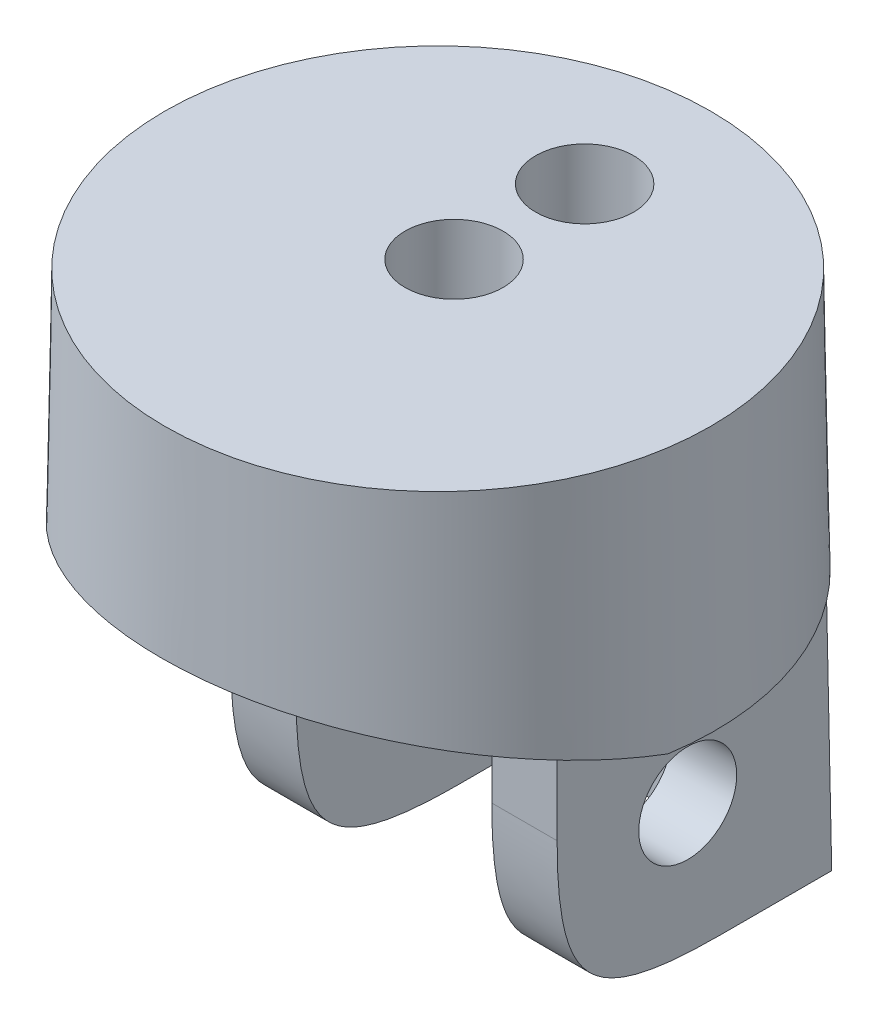
ISO-10303-21;
HEADER;
FILE_DESCRIPTION(('STEP AP214'),'2;1');
FILE_NAME('part.step','',(''),(''),'','','');
FILE_SCHEMA(('AUTOMOTIVE_DESIGN { 1 0 10303 214 1 1 1 1 }'));
ENDSEC;
DATA;
#1=APPLICATION_CONTEXT('core data for automotive mechanical design processes');
#2=APPLICATION_PROTOCOL_DEFINITION('international standard','automotive_design',2000,#1);
#3=PRODUCT_CONTEXT('',#1,'mechanical');
#4=PRODUCT('Part','Part','',(#3));
#5=PRODUCT_RELATED_PRODUCT_CATEGORY('part','',(#4));
#6=PRODUCT_DEFINITION_FORMATION('','',#4);
#7=PRODUCT_DEFINITION_CONTEXT('part definition',#1,'design');
#8=PRODUCT_DEFINITION('design','',#6,#7);
#9=PRODUCT_DEFINITION_SHAPE('','',#8);
#10=(LENGTH_UNIT() NAMED_UNIT(*) SI_UNIT(.MILLI.,.METRE.));
#11=(NAMED_UNIT(*) PLANE_ANGLE_UNIT() SI_UNIT($,.RADIAN.));
#12=(NAMED_UNIT(*) SI_UNIT($,.STERADIAN.) SOLID_ANGLE_UNIT());
#13=UNCERTAINTY_MEASURE_WITH_UNIT(LENGTH_MEASURE(1.E-05),#10,'distance_accuracy_value','');
#14=(GEOMETRIC_REPRESENTATION_CONTEXT(3) GLOBAL_UNCERTAINTY_ASSIGNED_CONTEXT((#13)) GLOBAL_UNIT_ASSIGNED_CONTEXT((#10,
#11,#12)) REPRESENTATION_CONTEXT('',''));
#15=CARTESIAN_POINT('',(0.,0.,0.));
#16=DIRECTION('',(0.,0.,1.));
#17=DIRECTION('',(1.,0.,0.));
#18=AXIS2_PLACEMENT_3D('',#15,#16,#17);
#19=CARTESIAN_POINT('',(0.,8.,0.));
#20=DIRECTION('',(0.,1.,0.));
#21=DIRECTION('',(0.,0.,1.));
#22=AXIS2_PLACEMENT_3D('',#19,#20,#21);
#23=PLANE('',#22);
#24=CARTESIAN_POINT('',(0.,8.,-0.5));
#25=DIRECTION('',(0.,1.,0.));
#26=DIRECTION('',(0.,0.,1.));
#27=AXIS2_PLACEMENT_3D('',#24,#25,#26);
#28=CIRCLE('',#27,1.5);
#29=CARTESIAN_POINT('',(0.,8.,1.));
#30=VERTEX_POINT('',#29);
#31=EDGE_CURVE('E274',#30,#30,#28,.F.);
#32=ORIENTED_EDGE('',*,*,#31,.T.);
#33=EDGE_LOOP('',(#32));
#34=FACE_BOUND('',#33,.T.);
#35=CARTESIAN_POINT('',(0.,8.,-4.5));
#36=DIRECTION('',(0.,1.,0.));
#37=DIRECTION('',(0.,0.,1.));
#38=AXIS2_PLACEMENT_3D('',#35,#36,#37);
#39=CIRCLE('',#38,1.5);
#40=CARTESIAN_POINT('',(0.,8.,-3.));
#41=VERTEX_POINT('',#40);
#42=EDGE_CURVE('E42',#41,#41,#39,.F.);
#43=ORIENTED_EDGE('',*,*,#42,.T.);
#44=EDGE_LOOP('',(#43));
#45=FACE_BOUND('',#44,.T.);
#46=CARTESIAN_POINT('',(0.,8.,0.));
#47=DIRECTION('',(0.,1.,0.));
#48=DIRECTION('',(0.,0.,1.));
#49=AXIS2_PLACEMENT_3D('',#46,#47,#48);
#50=CIRCLE('',#49,8.36035948057426);
#51=CARTESIAN_POINT('',(0.,8.,8.36035948057426));
#52=VERTEX_POINT('',#51);
#53=EDGE_CURVE('E275',#52,#52,#50,.F.);
#54=ORIENTED_EDGE('',*,*,#53,.F.);
#55=EDGE_LOOP('',(#54));
#56=FACE_BOUND('',#55,.T.);
#57=ADVANCED_FACE('F34',(#34,#45,#56),#23,.T.);
#58=CARTESIAN_POINT('',(0.,0.,0.));
#59=DIRECTION('',(0.,-1.,0.));
#60=DIRECTION('',(0.,0.,1.));
#61=AXIS2_PLACEMENT_3D('',#58,#59,#60);
#62=CONICAL_SURFACE('',#61,8.5,0.0174532925199433);
#63=CARTESIAN_POINT('',(0.,0.,0.));
#64=DIRECTION('',(0.,1.,0.));
#65=DIRECTION('',(0.,0.,1.));
#66=AXIS2_PLACEMENT_3D('',#63,#64,#65);
#67=CIRCLE('',#66,8.5);
#68=CARTESIAN_POINT('',(-8.39324774628024,0.,1.34290441564604));
#69=VERTEX_POINT('',#68);
#70=CARTESIAN_POINT('',(-5.,0.,-6.87386354243376));
#71=VERTEX_POINT('',#70);
#72=EDGE_CURVE('E200',#69,#71,#67,.F.);
#73=ORIENTED_EDGE('',*,*,#72,.F.);
#74=CARTESIAN_POINT('',(0.,-0.370490605018436,-0.0397853460097106));
#75=DIRECTION('',(0.,0.965925826289069,-0.258819045102518));
#76=DIRECTION('',(0.,-0.258819045102518,-0.965925826289069));
#77=AXIS2_PLACEMENT_3D('',#74,#75,#76);
#78=ELLIPSE('',#77,8.80654259990787,8.50637389762198);
#79=CARTESIAN_POINT('',(8.39324774628024,0.,1.34290441564604));
#80=VERTEX_POINT('',#79);
#81=EDGE_CURVE('E189',#80,#69,#78,.F.);
#82=ORIENTED_EDGE('',*,*,#81,.F.);
#83=CARTESIAN_POINT('',(0.,0.,0.));
#84=DIRECTION('',(0.,1.,0.));
#85=DIRECTION('',(0.,0.,1.));
#86=AXIS2_PLACEMENT_3D('',#83,#84,#85);
#87=CIRCLE('',#86,8.5);
#88=CARTESIAN_POINT('',(5.,0.,-6.87386354243376));
#89=VERTEX_POINT('',#88);
#90=EDGE_CURVE('E209',#89,#80,#87,.F.);
#91=ORIENTED_EDGE('',*,*,#90,.F.);
#92=CARTESIAN_POINT('',(5.,-24.8576985156656,-7.40367743203639));
#93=CARTESIAN_POINT('',(5.,-22.028515475189,-7.34408647566452));
#94=CARTESIAN_POINT('',(5.,-19.1993371463825,-7.28427152481865));
#95=CARTESIAN_POINT('',(5.,-13.5409908876973,-7.16415639491989));
#96=CARTESIAN_POINT('',(5.,-10.7118229578183,-7.1038562158837));
#97=CARTESIAN_POINT('',(5.,-5.0534982639313,-6.98273338595101));
#98=CARTESIAN_POINT('',(5.,-2.22434149992342,-6.92191073505196));
#99=CARTESIAN_POINT('',(5.,3.43395988768084,-6.79969889757456));
#100=CARTESIAN_POINT('',(5.,6.26310451127679,-6.73830971097671));
#101=CARTESIAN_POINT('',(5.,9.09224248686586,-6.67661522656715));
#102=B_SPLINE_CURVE_WITH_KNOTS('',3,(#92,#93,#94,#95,#96,#97,#98,#99,#100,#101),.UNSPECIFIED.,
.F.,.F.,(4,2,2,2,4),(0.,8.4894316553225,16.9788630183329,25.4682944227907,33.9577261196273),.UNSPECIFIED.);
#103=CARTESIAN_POINT('',(5.,-9.,-7.06719915925969));
#104=VERTEX_POINT('',#103);
#105=EDGE_CURVE('E343',#104,#89,#102,.T.);
#106=ORIENTED_EDGE('',*,*,#105,.F.);
#107=CARTESIAN_POINT('',(0.,-9.,0.));
#108=DIRECTION('',(0.,1.,0.));
#109=DIRECTION('',(0.,0.,1.));
#110=AXIS2_PLACEMENT_3D('',#107,#108,#109);
#111=CIRCLE('',#110,8.65709558435396);
#112=CARTESIAN_POINT('',(-5.,-9.,-7.06719915925969));
#113=VERTEX_POINT('',#112);
#114=EDGE_CURVE('E192',#104,#113,#111,.T.);
#115=ORIENTED_EDGE('',*,*,#114,.T.);
#116=CARTESIAN_POINT('',(-5.,-24.8576985156656,-7.40367743203639));
#117=CARTESIAN_POINT('',(-5.,-22.028515475189,-7.34408647566453));
#118=CARTESIAN_POINT('',(-5.,-19.1993371463825,-7.28427152481866));
#119=CARTESIAN_POINT('',(-5.,-13.5409908876973,-7.16415639491989));
#120=CARTESIAN_POINT('',(-5.,-10.7118229578183,-7.1038562158837));
#121=CARTESIAN_POINT('',(-5.,-5.05349826393131,-6.98273338595101));
#122=CARTESIAN_POINT('',(-5.,-2.22434149992342,-6.92191073505196));
#123=CARTESIAN_POINT('',(-5.,3.43395988768084,-6.79969889757456));
#124=CARTESIAN_POINT('',(-5.,6.26310451127679,-6.7383097109767));
#125=CARTESIAN_POINT('',(-5.,9.09224248686585,-6.67661522656714));
#126=B_SPLINE_CURVE_WITH_KNOTS('',3,(#116,#117,#118,#119,#120,#121,#122,#123,#124,#125),
.UNSPECIFIED.,.F.,.F.,(4,2,2,2,4),(0.,8.4894316553225,16.9788630183329,25.4682944227907,
33.9577261196273),.UNSPECIFIED.);
#127=EDGE_CURVE('E202',#113,#71,#126,.T.);
#128=ORIENTED_EDGE('',*,*,#127,.T.);
#129=EDGE_LOOP('',(#73,#82,#91,#106,#115,#128));
#130=FACE_BOUND('',#129,.T.);
#131=ORIENTED_EDGE('',*,*,#53,.T.);
#132=EDGE_LOOP('',(#131));
#133=FACE_BOUND('',#132,.T.);
#134=ADVANCED_FACE('F211',(#130,#133),#62,.T.);
#135=CARTESIAN_POINT('',(0.,-9.23352252799543,-0.5));
#136=DIRECTION('',(0.,1.,0.));
#137=DIRECTION('',(0.,0.,1.));
#138=AXIS2_PLACEMENT_3D('',#135,#136,#137);
#139=CYLINDRICAL_SURFACE('',#138,1.5);
#140=CARTESIAN_POINT('',(0.,0.,-0.5));
#141=DIRECTION('',(0.,1.,0.));
#142=DIRECTION('',(0.,0.,1.));
#143=AXIS2_PLACEMENT_3D('',#140,#141,#142);
#144=CIRCLE('',#143,1.5);
#145=CARTESIAN_POINT('',(0.,0.,1.));
#146=VERTEX_POINT('',#145);
#147=EDGE_CURVE('E11',#146,#146,#144,.F.);
#148=ORIENTED_EDGE('',*,*,#147,.T.);
#149=EDGE_LOOP('',(#148));
#150=FACE_BOUND('',#149,.T.);
#151=ORIENTED_EDGE('',*,*,#31,.F.);
#152=EDGE_LOOP('',(#151));
#153=FACE_BOUND('',#152,.T.);
#154=ADVANCED_FACE('F261',(#150,#153),#139,.F.);
#155=CARTESIAN_POINT('',(0.,-9.23352252799543,-4.5));
#156=DIRECTION('',(0.,1.,0.));
#157=DIRECTION('',(0.,0.,1.));
#158=AXIS2_PLACEMENT_3D('',#155,#156,#157);
#159=CYLINDRICAL_SURFACE('',#158,1.5);
#160=CARTESIAN_POINT('',(0.,0.,-4.5));
#161=DIRECTION('',(0.,1.,0.));
#162=DIRECTION('',(0.,0.,1.));
#163=AXIS2_PLACEMENT_3D('',#160,#161,#162);
#164=CIRCLE('',#163,1.5);
#165=CARTESIAN_POINT('',(0.,0.,-3.));
#166=VERTEX_POINT('',#165);
#167=EDGE_CURVE('E47',#166,#166,#164,.F.);
#168=ORIENTED_EDGE('',*,*,#167,.T.);
#169=EDGE_LOOP('',(#168));
#170=FACE_BOUND('',#169,.T.);
#171=ORIENTED_EDGE('',*,*,#42,.F.);
#172=EDGE_LOOP('',(#171));
#173=FACE_BOUND('',#172,.T.);
#174=ADVANCED_FACE('F258',(#170,#173),#159,.F.);
#175=CARTESIAN_POINT('',(-8.65709558435396,-9.,1.34290441564604));
#176=DIRECTION('',(0.,0.,-1.));
#177=DIRECTION('',(-1.,0.,0.));
#178=AXIS2_PLACEMENT_3D('',#175,#176,#177);
#179=PLANE('',#178);
#180=DIRECTION('',(1.,0.,0.));
#181=VECTOR('',#180,1.);
#182=CARTESIAN_POINT('',(-8.65709558435396,0.,1.34290441564604));
#183=LINE('',#182,#181);
#184=CARTESIAN_POINT('',(3.,0.,1.34290441564604));
#185=VERTEX_POINT('',#184);
#186=CARTESIAN_POINT('',(5.,0.,1.34290441564604));
#187=VERTEX_POINT('',#186);
#188=EDGE_CURVE('E199',#185,#187,#183,.T.);
#189=ORIENTED_EDGE('',*,*,#188,.F.);
#190=DIRECTION('',(0.,-1.,0.));
#191=VECTOR('',#190,1.);
#192=CARTESIAN_POINT('',(3.,-9.,1.34290441564604));
#193=LINE('',#192,#191);
#194=CARTESIAN_POINT('',(3.,-4.,1.34290441564604));
#195=VERTEX_POINT('',#194);
#196=EDGE_CURVE('E297',#185,#195,#193,.T.);
#197=ORIENTED_EDGE('',*,*,#196,.T.);
#198=CARTESIAN_POINT('',(5.5,-4.,1.34290441564604));
#199=CARTESIAN_POINT('',(1.83333333333333,-4.,1.34290441564604));
#200=CARTESIAN_POINT('',(-1.83333333333334,-4.,1.34290441564604));
#201=CARTESIAN_POINT('',(-5.5,-4.,1.34290441564604));
#202=(BOUNDED_CURVE() B_SPLINE_CURVE(3,(#198,#199,#200,#201),.UNSPECIFIED.,.F.,
.F.) B_SPLINE_CURVE_WITH_KNOTS((4,4),(-0.0055,0.0055),
.UNSPECIFIED.) CURVE() GEOMETRIC_REPRESENTATION_ITEM() RATIONAL_B_SPLINE_CURVE((1.,1.,1.,1.)) REPRESENTATION_ITEM(''));
#203=CARTESIAN_POINT('',(5.,-4.,1.34290441564604));
#204=VERTEX_POINT('',#203);
#205=EDGE_CURVE('E152',#195,#204,#202,.F.);
#206=ORIENTED_EDGE('',*,*,#205,.T.);
#207=DIRECTION('',(0.,-1.,0.));
#208=VECTOR('',#207,1.);
#209=CARTESIAN_POINT('',(5.,0.,1.34290441564604));
#210=LINE('',#209,#208);
#211=EDGE_CURVE('E159',#187,#204,#210,.T.);
#212=ORIENTED_EDGE('',*,*,#211,.F.);
#213=EDGE_LOOP('',(#189,#197,#206,#212));
#214=FACE_BOUND('',#213,.T.);
#215=ADVANCED_FACE('F260',(#214),#179,.F.);
#216=CARTESIAN_POINT('',(-8.5,-5.,-2.65709558435396));
#217=DIRECTION('',(1.,0.,0.));
#218=DIRECTION('',(0.,1.,0.));
#219=AXIS2_PLACEMENT_3D('',#216,#217,#218);
#220=CYLINDRICAL_SURFACE('',#219,1.5);
#221=CARTESIAN_POINT('',(3.,-5.,-2.65709558435396));
#222=DIRECTION('',(1.,0.,0.));
#223=DIRECTION('',(0.,0.,-1.));
#224=AXIS2_PLACEMENT_3D('',#221,#222,#223);
#225=CIRCLE('',#224,1.5);
#226=CARTESIAN_POINT('',(3.,-5.,-4.15709558435396));
#227=VERTEX_POINT('',#226);
#228=EDGE_CURVE('E188',#227,#227,#225,.F.);
#229=ORIENTED_EDGE('',*,*,#228,.T.);
#230=EDGE_LOOP('',(#229));
#231=FACE_BOUND('',#230,.T.);
#232=CARTESIAN_POINT('',(5.,-5.,-2.65709558435396));
#233=DIRECTION('',(-1.,0.,0.));
#234=DIRECTION('',(0.,-1.,0.));
#235=AXIS2_PLACEMENT_3D('',#232,#233,#234);
#236=CIRCLE('',#235,1.5);
#237=CARTESIAN_POINT('',(5.,-6.5,-2.65709558435396));
#238=VERTEX_POINT('',#237);
#239=EDGE_CURVE('E163',#238,#238,#236,.T.);
#240=ORIENTED_EDGE('',*,*,#239,.F.);
#241=EDGE_LOOP('',(#240));
#242=FACE_BOUND('',#241,.T.);
#243=ADVANCED_FACE('F227',(#231,#242),#220,.F.);
#244=CARTESIAN_POINT('',(5.5,-9.,-3.65709558435396));
#245=CARTESIAN_POINT('',(1.83333333333333,-9.,-3.65709558435396));
#246=CARTESIAN_POINT('',(-1.83333333333334,-9.,-3.65709558435396));
#247=CARTESIAN_POINT('',(-5.5,-9.,-3.65709558435396));
#248=CARTESIAN_POINT('',(5.5,-9.,1.34290441564604));
#249=CARTESIAN_POINT('',(1.83333333333333,-9.,1.34290441564604));
#250=CARTESIAN_POINT('',(-1.83333333333334,-9.,1.34290441564604));
#251=CARTESIAN_POINT('',(-5.5,-9.,1.34290441564604));
#252=CARTESIAN_POINT('',(5.5,-4.,1.34290441564604));
#253=CARTESIAN_POINT('',(1.83333333333333,-4.,1.34290441564604));
#254=CARTESIAN_POINT('',(-1.83333333333334,-4.,1.34290441564604));
#255=CARTESIAN_POINT('',(-5.5,-4.,1.34290441564604));
#256=(BOUNDED_SURFACE() B_SPLINE_SURFACE(2,3,((#244,#245,#246,#247),(#248,#249,#250,#251),(#252,
#253,#254,#255)),.UNSPECIFIED.,.F.,.F.,.F.) B_SPLINE_SURFACE_WITH_KNOTS((3,3),(4,4),(0.,1.),
(-0.0055,0.0055),.UNSPECIFIED.) GEOMETRIC_REPRESENTATION_ITEM() RATIONAL_B_SPLINE_SURFACE(((1.,
1.,1.,1.),(1.5,1.5,1.5,1.5),(1.,1.,1.,1.))) REPRESENTATION_ITEM('') SURFACE());
#257=CARTESIAN_POINT('',(3.,-9.,-3.65709558435396));
#258=CARTESIAN_POINT('',(3.,-8.99998512607998,-3.54068744938596));
#259=CARTESIAN_POINT('',(3.,-8.99909534970603,-3.42427175128301));
#260=CARTESIAN_POINT('',(3.,-8.99516845153947,-3.19122710151393));
#261=CARTESIAN_POINT('',(3.,-8.99212671129668,-3.07459823025858));
#262=CARTESIAN_POINT('',(3.,-8.9834914400148,-2.84133439335992));
#263=CARTESIAN_POINT('',(3.,-8.97789580218946,-2.72469950233504));
#264=CARTESIAN_POINT('',(3.,-8.96346766078072,-2.48907889448484));
#265=CARTESIAN_POINT('',(3.,-8.95456742795917,-2.37009719960083));
#266=CARTESIAN_POINT('',(3.,-8.9328406599847,-2.13256312068819));
#267=CARTESIAN_POINT('',(3.,-8.92001669298794,-2.01401050702065));
#268=CARTESIAN_POINT('',(3.,-8.88952198418169,-1.77756880151202));
#269=CARTESIAN_POINT('',(3.,-8.87185355003345,-1.65967942095745));
#270=CARTESIAN_POINT('',(3.,-8.83466610246216,-1.44876837243137));
#271=CARTESIAN_POINT('',(3.,-8.81624986989629,-1.35555415251726));
#272=CARTESIAN_POINT('',(3.,-8.77481033496396,-1.17012414629113));
#273=CARTESIAN_POINT('',(3.,-8.75178635154349,-1.07790850970233));
#274=CARTESIAN_POINT('',(3.,-8.70033797564743,-0.895356062111268));
#275=CARTESIAN_POINT('',(3.,-8.67193452523028,-0.805013424588873));
#276=CARTESIAN_POINT('',(3.,-8.60867311524866,-0.62660620755472));
#277=CARTESIAN_POINT('',(3.,-8.57381712928964,-0.538540940836368));
#278=CARTESIAN_POINT('',(3.,-8.50552448743983,-0.385639170211926));
#279=CARTESIAN_POINT('',(3.,-8.47361027853266,-0.32012463466014));
#280=CARTESIAN_POINT('',(3.,-8.40495674314471,-0.191682356454597));
#281=CARTESIAN_POINT('',(3.,-8.36821905765713,-0.128753743562137));
#282=CARTESIAN_POINT('',(3.,-8.28971677903505,-0.00627545456435621));
#283=CARTESIAN_POINT('',(3.,-8.24796242794195,0.0532807526426417));
#284=CARTESIAN_POINT('',(3.,-8.15931137996597,0.168443889683574));
#285=CARTESIAN_POINT('',(3.,-8.11241492592295,0.224051005812277));
#286=CARTESIAN_POINT('',(3.,-8.01342633698371,0.330978540420345));
#287=CARTESIAN_POINT('',(3.,-7.96130831783417,0.382275025080573));
#288=CARTESIAN_POINT('',(3.,-7.85255382795779,0.479824136812843));
#289=CARTESIAN_POINT('',(3.,-7.7959172858132,0.526076684135309));
#290=CARTESIAN_POINT('',(3.,-7.67868654041195,0.613443561402008));
#291=CARTESIAN_POINT('',(3.,-7.61808631823121,0.654549787190362));
#292=CARTESIAN_POINT('',(3.,-7.49372578723686,0.731648180641213));
#293=CARTESIAN_POINT('',(3.,-7.42996501148473,0.767639589587758));
#294=CARTESIAN_POINT('',(3.,-7.27079636627212,0.849886814316382));
#295=CARTESIAN_POINT('',(3.,-7.17402442223272,0.893502996098705));
#296=CARTESIAN_POINT('',(3.,-6.97700257890409,0.971987352840942));
#297=CARTESIAN_POINT('',(3.,-6.87675048226364,1.00684988207886));
#298=CARTESIAN_POINT('',(3.,-6.67325244247732,1.06949683694268));
#299=CARTESIAN_POINT('',(3.,-6.56998944779724,1.09722499337945));
#300=CARTESIAN_POINT('',(3.,-6.36207069648878,1.14657696231785));
#301=CARTESIAN_POINT('',(3.,-6.25741528765284,1.16820227026979));
#302=CARTESIAN_POINT('',(3.,-6.03232379432097,1.20918728056912));
#303=CARTESIAN_POINT('',(3.,-5.91175235266287,1.22779209731512));
#304=CARTESIAN_POINT('',(3.,-5.66988578770702,1.25983874189342));
#305=CARTESIAN_POINT('',(3.,-5.54859034285232,1.27327807040996));
#306=CARTESIAN_POINT('',(3.,-5.30553533857615,1.29600002288403));
#307=CARTESIAN_POINT('',(3.,-5.18377551561359,1.30527975750944));
#308=CARTESIAN_POINT('',(3.,-4.94392351658425,1.32020483367187));
#309=CARTESIAN_POINT('',(3.,-4.82583773627722,1.3259562890276));
#310=CARTESIAN_POINT('',(3.,-4.58967634174576,1.3348273037448));
#311=CARTESIAN_POINT('',(3.,-4.47160081106627,1.33794918854397));
#312=CARTESIAN_POINT('',(3.,-4.2356807946031,1.3419773776831));
#313=CARTESIAN_POINT('',(3.,-4.11783639796264,1.34288873247267));
#314=CARTESIAN_POINT('',(3.,-4.,1.34290441564604));
#315=B_SPLINE_CURVE_WITH_KNOTS('',3,(#257,#258,#259,#260,#261,#262,#263,#264,#265,#266,#267,
#268,#269,#270,#271,#272,#273,#274,#275,#276,#277,#278,#279,#280,#281,#282,#283,#284,#285,#286,
#287,#288,#289,#290,#291,#292,#293,#294,#295,#296,#297,#298,#299,#300,#301,#302,#303,#304,#305,
#306,#307,#308,#309,#310,#311,#312,#313,#314),.UNSPECIFIED.,.F.,.F.,(4,2,2,2,2,2,2,2,2,2,2,2,2,
2,2,2,2,2,2,2,2,2,2,2,2,2,2,2,4),(0.,0.349232634569233,0.699217059465083,1.04949072023739,
1.40737984868018,1.76503523138942,2.12252054010917,2.40747536983453,2.69247234878998,
2.9763818392992,3.26020463485198,3.47865094490237,3.69702312905684,3.91495682683875,
4.13288023695875,4.3519430899317,4.57100940600035,4.79041646923081,5.00985604472361,
5.32774881711761,5.64584609279589,5.96638021657095,6.28683572789285,6.65268592993992,
7.0187129260305,7.38499377884795,7.73963602530321,8.09396431672681,8.44748230027824),.UNSPECIFIED.);
#316=CARTESIAN_POINT('',(3.,-9.,-3.65709558435396));
#317=VERTEX_POINT('',#316);
#318=EDGE_CURVE('E145',#317,#195,#315,.T.);
#319=CARTESIAN_POINT('',(-5.5,-9.,-3.65709558435396));
#320=CARTESIAN_POINT('',(-1.83333333333334,-9.,-3.65709558435396));
#321=CARTESIAN_POINT('',(1.83333333333333,-9.,-3.65709558435396));
#322=CARTESIAN_POINT('',(5.5,-9.,-3.65709558435396));
#323=(BOUNDED_CURVE() B_SPLINE_CURVE(3,(#319,#320,#321,#322),.UNSPECIFIED.,.F.,
.F.) B_SPLINE_CURVE_WITH_KNOTS((4,4),(-0.0055,0.0055),
.UNSPECIFIED.) CURVE() GEOMETRIC_REPRESENTATION_ITEM() RATIONAL_B_SPLINE_CURVE((1.,1.,1.,1.)) REPRESENTATION_ITEM(''));
#324=CARTESIAN_POINT('',(5.,-9.,-3.65709558435396));
#325=VERTEX_POINT('',#324);
#326=EDGE_CURVE('E368',#325,#317,#323,.F.);
#327=CARTESIAN_POINT('',(5.,-9.,-3.65709558435396));
#328=CARTESIAN_POINT('',(5.,-9.,1.34290441564604));
#329=CARTESIAN_POINT('',(5.,-4.,1.34290441564604));
#330=(BOUNDED_CURVE() B_SPLINE_CURVE(2,(#327,#328,#329),.UNSPECIFIED.,.F.,
.F.) B_SPLINE_CURVE_WITH_KNOTS((3,3),(0.,1.),
.UNSPECIFIED.) CURVE() GEOMETRIC_REPRESENTATION_ITEM() RATIONAL_B_SPLINE_CURVE((1.,1.5,1.)) REPRESENTATION_ITEM(''));
#331=EDGE_CURVE('E144',#204,#325,#330,.F.);
#332=ORIENTED_EDGE('',*,*,#318,.F.);
#333=ORIENTED_EDGE('',*,*,#326,.F.);
#334=ORIENTED_EDGE('',*,*,#331,.F.);
#335=ORIENTED_EDGE('',*,*,#205,.F.);
#336=EDGE_LOOP('',(#332,#333,#334,#335));
#337=FACE_BOUND('',#336,.T.);
#338=ADVANCED_FACE('F326',(#337),#256,.T.);
#339=CARTESIAN_POINT('',(0.,-9.,0.));
#340=DIRECTION('',(0.,1.,0.));
#341=DIRECTION('',(0.,0.,1.));
#342=AXIS2_PLACEMENT_3D('',#339,#340,#341);
#343=PLANE('',#342);
#344=ORIENTED_EDGE('',*,*,#326,.T.);
#345=DIRECTION('',(0.,0.,-1.));
#346=VECTOR('',#345,1.);
#347=CARTESIAN_POINT('',(3.,-9.,0.));
#348=LINE('',#347,#346);
#349=CARTESIAN_POINT('',(3.,-9.,-5.44952698805985));
#350=VERTEX_POINT('',#349);
#351=EDGE_CURVE('E300',#317,#350,#348,.T.);
#352=ORIENTED_EDGE('',*,*,#351,.T.);
#353=CARTESIAN_POINT('',(0.,-9.,0.));
#354=DIRECTION('',(0.,1.,0.));
#355=DIRECTION('',(0.,0.,1.));
#356=AXIS2_PLACEMENT_3D('',#353,#354,#355);
#357=CIRCLE('',#356,6.22071896114852);
#358=CARTESIAN_POINT('',(-3.,-9.,-5.44952698805986));
#359=VERTEX_POINT('',#358);
#360=EDGE_CURVE('E243',#350,#359,#357,.T.);
#361=ORIENTED_EDGE('',*,*,#360,.T.);
#362=DIRECTION('',(0.,0.,1.));
#363=VECTOR('',#362,1.);
#364=CARTESIAN_POINT('',(-3.,-9.,0.));
#365=LINE('',#364,#363);
#366=CARTESIAN_POINT('',(-3.,-9.,-3.65709558435396));
#367=VERTEX_POINT('',#366);
#368=EDGE_CURVE('E134',#359,#367,#365,.T.);
#369=ORIENTED_EDGE('',*,*,#368,.T.);
#370=CARTESIAN_POINT('',(-5.5,-9.,-3.65709558435396));
#371=CARTESIAN_POINT('',(-1.83333333333334,-9.,-3.65709558435396));
#372=CARTESIAN_POINT('',(1.83333333333333,-9.,-3.65709558435396));
#373=CARTESIAN_POINT('',(5.5,-9.,-3.65709558435396));
#374=(BOUNDED_CURVE() B_SPLINE_CURVE(3,(#370,#371,#372,#373),.UNSPECIFIED.,.F.,
.F.) B_SPLINE_CURVE_WITH_KNOTS((4,4),(-0.0055,0.0055),
.UNSPECIFIED.) CURVE() GEOMETRIC_REPRESENTATION_ITEM() RATIONAL_B_SPLINE_CURVE((1.,1.,1.,1.)) REPRESENTATION_ITEM(''));
#375=CARTESIAN_POINT('',(-5.,-9.,-3.65709558435396));
#376=VERTEX_POINT('',#375);
#377=EDGE_CURVE('E142',#367,#376,#374,.F.);
#378=ORIENTED_EDGE('',*,*,#377,.T.);
#379=DIRECTION('',(0.,0.,1.));
#380=VECTOR('',#379,1.);
#381=CARTESIAN_POINT('',(-5.,-9.,-8.65709558435396));
#382=LINE('',#381,#380);
#383=EDGE_CURVE('E179',#113,#376,#382,.T.);
#384=ORIENTED_EDGE('',*,*,#383,.F.);
#385=ORIENTED_EDGE('',*,*,#114,.F.);
#386=DIRECTION('',(0.,0.,1.));
#387=VECTOR('',#386,1.);
#388=CARTESIAN_POINT('',(5.,-9.,-8.65709558435396));
#389=LINE('',#388,#387);
#390=EDGE_CURVE('E183',#104,#325,#389,.T.);
#391=ORIENTED_EDGE('',*,*,#390,.T.);
#392=EDGE_LOOP('',(#344,#352,#361,#369,#378,#384,#385,#391));
#393=FACE_BOUND('',#392,.T.);
#394=ADVANCED_FACE('F318',(#393),#343,.F.);
#395=CARTESIAN_POINT('',(5.5,-4.,1.34290441564604));
#396=CARTESIAN_POINT('',(1.83333333333333,-4.,1.34290441564604));
#397=CARTESIAN_POINT('',(-1.83333333333334,-4.,1.34290441564604));
#398=CARTESIAN_POINT('',(-5.5,-4.,1.34290441564604));
#399=(BOUNDED_CURVE() B_SPLINE_CURVE(3,(#395,#396,#397,#398),.UNSPECIFIED.,.F.,
.F.) B_SPLINE_CURVE_WITH_KNOTS((4,4),(-0.0055,0.0055),
.UNSPECIFIED.) CURVE() GEOMETRIC_REPRESENTATION_ITEM() RATIONAL_B_SPLINE_CURVE((1.,1.,1.,1.)) REPRESENTATION_ITEM(''));
#400=CARTESIAN_POINT('',(-5.,-4.,1.34290441564604));
#401=VERTEX_POINT('',#400);
#402=CARTESIAN_POINT('',(-3.,-4.,1.34290441564604));
#403=VERTEX_POINT('',#402);
#404=EDGE_CURVE('E140',#401,#403,#399,.F.);
#405=ORIENTED_EDGE('',*,*,#404,.T.);
#406=DIRECTION('',(0.,1.,0.));
#407=VECTOR('',#406,1.);
#408=CARTESIAN_POINT('',(-3.,-9.,1.34290441564604));
#409=LINE('',#408,#407);
#410=CARTESIAN_POINT('',(-3.,0.,1.34290441564604));
#411=VERTEX_POINT('',#410);
#412=EDGE_CURVE('E123',#403,#411,#409,.T.);
#413=ORIENTED_EDGE('',*,*,#412,.T.);
#414=CARTESIAN_POINT('',(-5.,0.,1.34290441564604));
#415=VERTEX_POINT('',#414);
#416=EDGE_CURVE('E198',#415,#411,#183,.T.);
#417=ORIENTED_EDGE('',*,*,#416,.F.);
#418=DIRECTION('',(0.,-1.,0.));
#419=VECTOR('',#418,1.);
#420=CARTESIAN_POINT('',(-5.,0.,1.34290441564604));
#421=LINE('',#420,#419);
#422=EDGE_CURVE('E151',#415,#401,#421,.T.);
#423=ORIENTED_EDGE('',*,*,#422,.T.);
#424=EDGE_LOOP('',(#405,#413,#417,#423));
#425=FACE_BOUND('',#424,.T.);
#426=ADVANCED_FACE('F149',(#425),#179,.F.);
#427=CARTESIAN_POINT('',(-8.65709558435396,0.,1.34290441564604));
#428=DIRECTION('',(0.,0.965925826289069,-0.258819045102518));
#429=DIRECTION('',(0.,0.258819045102518,0.965925826289069));
#430=AXIS2_PLACEMENT_3D('',#427,#428,#429);
#431=PLANE('',#430);
#432=ORIENTED_EDGE('',*,*,#81,.T.);
#433=EDGE_CURVE('E195',#69,#415,#183,.T.);
#434=ORIENTED_EDGE('',*,*,#433,.T.);
#435=ORIENTED_EDGE('',*,*,#416,.T.);
#436=EDGE_CURVE('E421',#411,#185,#183,.T.);
#437=ORIENTED_EDGE('',*,*,#436,.T.);
#438=ORIENTED_EDGE('',*,*,#188,.T.);
#439=EDGE_CURVE('E203',#187,#80,#183,.T.);
#440=ORIENTED_EDGE('',*,*,#439,.T.);
#441=EDGE_LOOP('',(#432,#434,#435,#437,#438,#440));
#442=FACE_BOUND('',#441,.T.);
#443=ADVANCED_FACE('F331',(#442),#431,.F.);
#444=CARTESIAN_POINT('',(0.,0.,-8.65709558435396));
#445=DIRECTION('',(0.,1.,0.));
#446=DIRECTION('',(0.,0.,1.));
#447=AXIS2_PLACEMENT_3D('',#444,#445,#446);
#448=PLANE('',#447);
#449=ORIENTED_EDGE('',*,*,#90,.T.);
#450=ORIENTED_EDGE('',*,*,#439,.F.);
#451=DIRECTION('',(0.,0.,1.));
#452=VECTOR('',#451,1.);
#453=CARTESIAN_POINT('',(5.,0.,-8.65709558435396));
#454=LINE('',#453,#452);
#455=EDGE_CURVE('E164',#89,#187,#454,.T.);
#456=ORIENTED_EDGE('',*,*,#455,.F.);
#457=EDGE_LOOP('',(#449,#450,#456));
#458=FACE_BOUND('',#457,.T.);
#459=ADVANCED_FACE('F334',(#458),#448,.F.);
#460=CARTESIAN_POINT('',(5.,0.,-8.65709558435396));
#461=DIRECTION('',(-1.,0.,0.));
#462=DIRECTION('',(0.,-1.,0.));
#463=AXIS2_PLACEMENT_3D('',#460,#461,#462);
#464=PLANE('',#463);
#465=ORIENTED_EDGE('',*,*,#239,.T.);
#466=EDGE_LOOP('',(#465));
#467=FACE_BOUND('',#466,.T.);
#468=ORIENTED_EDGE('',*,*,#211,.T.);
#469=ORIENTED_EDGE('',*,*,#331,.T.);
#470=ORIENTED_EDGE('',*,*,#390,.F.);
#471=ORIENTED_EDGE('',*,*,#105,.T.);
#472=ORIENTED_EDGE('',*,*,#455,.T.);
#473=EDGE_LOOP('',(#468,#469,#470,#471,#472));
#474=FACE_BOUND('',#473,.T.);
#475=ADVANCED_FACE('F337',(#467,#474),#464,.F.);
#476=CARTESIAN_POINT('',(0.,0.,-8.65709558435396));
#477=DIRECTION('',(0.,1.,0.));
#478=DIRECTION('',(0.,0.,1.));
#479=AXIS2_PLACEMENT_3D('',#476,#477,#478);
#480=PLANE('',#479);
#481=ORIENTED_EDGE('',*,*,#72,.T.);
#482=DIRECTION('',(0.,0.,1.));
#483=VECTOR('',#482,1.);
#484=CARTESIAN_POINT('',(-5.,0.,-8.65709558435396));
#485=LINE('',#484,#483);
#486=EDGE_CURVE('E176',#71,#415,#485,.T.);
#487=ORIENTED_EDGE('',*,*,#486,.T.);
#488=ORIENTED_EDGE('',*,*,#433,.F.);
#489=EDGE_LOOP('',(#481,#487,#488));
#490=FACE_BOUND('',#489,.T.);
#491=ADVANCED_FACE('F220',(#490),#480,.F.);
#492=CARTESIAN_POINT('',(-5.,0.,-8.65709558435396));
#493=DIRECTION('',(-1.,0.,0.));
#494=DIRECTION('',(0.,-1.,0.));
#495=AXIS2_PLACEMENT_3D('',#492,#493,#494);
#496=PLANE('',#495);
#497=CARTESIAN_POINT('',(-5.,-5.,-2.65709558435396));
#498=DIRECTION('',(-1.,0.,0.));
#499=DIRECTION('',(0.,-1.,0.));
#500=AXIS2_PLACEMENT_3D('',#497,#498,#499);
#501=CIRCLE('',#500,1.5);
#502=CARTESIAN_POINT('',(-5.,-6.5,-2.65709558435396));
#503=VERTEX_POINT('',#502);
#504=EDGE_CURVE('E185',#503,#503,#501,.T.);
#505=ORIENTED_EDGE('',*,*,#504,.F.);
#506=EDGE_LOOP('',(#505));
#507=FACE_BOUND('',#506,.T.);
#508=ORIENTED_EDGE('',*,*,#383,.T.);
#509=CARTESIAN_POINT('',(-5.,-4.,1.34290441564604));
#510=CARTESIAN_POINT('',(-5.,-9.,1.34290441564604));
#511=CARTESIAN_POINT('',(-5.,-9.,-3.65709558435396));
#512=(BOUNDED_CURVE() B_SPLINE_CURVE(2,(#509,#510,#511),.UNSPECIFIED.,.F.,
.F.) B_SPLINE_CURVE_WITH_KNOTS((3,3),(0.,1.),
.UNSPECIFIED.) CURVE() GEOMETRIC_REPRESENTATION_ITEM() RATIONAL_B_SPLINE_CURVE((1.,1.5,1.)) REPRESENTATION_ITEM(''));
#513=EDGE_CURVE('E372',#376,#401,#512,.F.);
#514=ORIENTED_EDGE('',*,*,#513,.T.);
#515=ORIENTED_EDGE('',*,*,#422,.F.);
#516=ORIENTED_EDGE('',*,*,#486,.F.);
#517=ORIENTED_EDGE('',*,*,#127,.F.);
#518=EDGE_LOOP('',(#508,#514,#515,#516,#517));
#519=FACE_BOUND('',#518,.T.);
#520=ADVANCED_FACE('F214',(#507,#519),#496,.T.);
#521=CARTESIAN_POINT('',(-3.,-5.,-2.65709558435396));
#522=DIRECTION('',(-1.,0.,0.));
#523=DIRECTION('',(0.,0.,1.));
#524=AXIS2_PLACEMENT_3D('',#521,#522,#523);
#525=CIRCLE('',#524,1.5);
#526=CARTESIAN_POINT('',(-3.,-5.,-1.15709558435396));
#527=VERTEX_POINT('',#526);
#528=EDGE_CURVE('E292',#527,#527,#525,.F.);
#529=ORIENTED_EDGE('',*,*,#528,.T.);
#530=EDGE_LOOP('',(#529));
#531=FACE_BOUND('',#530,.T.);
#532=ORIENTED_EDGE('',*,*,#504,.T.);
#533=EDGE_LOOP('',(#532));
#534=FACE_BOUND('',#533,.T.);
#535=ADVANCED_FACE('F219',(#531,#534),#220,.F.);
#536=CARTESIAN_POINT('',(-3.,-4.,1.34290441564604));
#537=CARTESIAN_POINT('',(-3.,-4.116408134968,1.34288954172602));
#538=CARTESIAN_POINT('',(-3.,-4.23282383307095,1.34199976535207));
#539=CARTESIAN_POINT('',(-3.,-4.46586848284003,1.33807286718551));
#540=CARTESIAN_POINT('',(-3.,-4.58249735409538,1.33503112694272));
#541=CARTESIAN_POINT('',(-3.,-4.81576119099404,1.32639585566084));
#542=CARTESIAN_POINT('',(-3.,-4.93239608201892,1.3208002178355));
#543=CARTESIAN_POINT('',(-3.,-5.16801668986912,1.30637207642676));
#544=CARTESIAN_POINT('',(-3.,-5.28699838475312,1.29747184360522));
#545=CARTESIAN_POINT('',(-3.,-5.52453246366577,1.27574507563074));
#546=CARTESIAN_POINT('',(-3.,-5.64308507733331,1.26292110863398));
#547=CARTESIAN_POINT('',(-3.,-5.87952678284193,1.23242639982774));
#548=CARTESIAN_POINT('',(-3.,-5.99741616339651,1.21475796567949));
#549=CARTESIAN_POINT('',(-3.,-6.20832721192259,1.1775705181082));
#550=CARTESIAN_POINT('',(-3.,-6.3015414318367,1.15915428554233));
#551=CARTESIAN_POINT('',(-3.,-6.48697143806282,1.11771475061));
#552=CARTESIAN_POINT('',(-3.,-6.57918707465163,1.09469076718953));
#553=CARTESIAN_POINT('',(-3.,-6.76173952224269,1.04324239129347));
#554=CARTESIAN_POINT('',(-3.,-6.85208215976509,1.01483894087632));
#555=CARTESIAN_POINT('',(-3.,-7.03048937679924,0.951577530894699));
#556=CARTESIAN_POINT('',(-3.,-7.11855464351759,0.916721544935684));
#557=CARTESIAN_POINT('',(-3.,-7.27145641414204,0.84842890308587));
#558=CARTESIAN_POINT('',(-3.,-7.33697094969382,0.816514694178701));
#559=CARTESIAN_POINT('',(-3.,-7.46541322789937,0.747861158790748));
#560=CARTESIAN_POINT('',(-3.,-7.52834184079182,0.711123473303172));
#561=CARTESIAN_POINT('',(-3.,-7.6508201297896,0.63262119468109));
#562=CARTESIAN_POINT('',(-3.,-7.7103763369966,0.590866843587996));
#563=CARTESIAN_POINT('',(-3.,-7.82553947403753,0.502215795612008));
#564=CARTESIAN_POINT('',(-2.99999999999999,-7.88114659016624,0.455319341568991));
#565=CARTESIAN_POINT('',(-2.99999999999999,-7.9880741247743,0.356330752629747));
#566=CARTESIAN_POINT('',(-3.,-8.03937060943453,0.30421273348021));
#567=CARTESIAN_POINT('',(-3.,-8.13691972116681,0.195458243603833));
#568=CARTESIAN_POINT('',(-3.,-8.18317226848927,0.13882170145924));
#569=CARTESIAN_POINT('',(-3.,-8.27053914575597,0.0215909560579871));
#570=CARTESIAN_POINT('',(-3.,-8.31164537154432,-0.0390092661227497));
#571=CARTESIAN_POINT('',(-3.,-8.38874376499517,-0.1633697971171));
#572=CARTESIAN_POINT('',(-3.,-8.42473517394172,-0.227130572869233));
#573=CARTESIAN_POINT('',(-3.,-8.50698239867034,-0.386299218081841));
#574=CARTESIAN_POINT('',(-3.,-8.55059858045267,-0.483071162121241));
#575=CARTESIAN_POINT('',(-3.,-8.6290829371949,-0.680093005449876));
#576=CARTESIAN_POINT('',(-3.,-8.66394546643282,-0.780345102090327));
#577=CARTESIAN_POINT('',(-3.,-8.72659242129664,-0.983843141876644));
#578=CARTESIAN_POINT('',(-3.,-8.75432057773341,-1.08710613655672));
#579=CARTESIAN_POINT('',(-3.,-8.80367254667181,-1.29502488786519));
#580=CARTESIAN_POINT('',(-3.,-8.82529785462375,-1.39968029670112));
#581=CARTESIAN_POINT('',(-3.,-8.86628286492308,-1.624771790033));
#582=CARTESIAN_POINT('',(-3.,-8.88488768166908,-1.74534323169109));
#583=CARTESIAN_POINT('',(-3.,-8.91693432624738,-1.98720979664694));
#584=CARTESIAN_POINT('',(-3.,-8.93037365476392,-2.10850524150165));
#585=CARTESIAN_POINT('',(-3.,-8.95309560723799,-2.35156024577781));
#586=CARTESIAN_POINT('',(-3.,-8.96237534186339,-2.47332006874037));
#587=CARTESIAN_POINT('',(-3.,-8.97730041802582,-2.71317206776971));
#588=CARTESIAN_POINT('',(-3.,-8.98305187338156,-2.83125784807674));
#589=CARTESIAN_POINT('',(-3.,-8.99192288809876,-3.0674192426082));
#590=CARTESIAN_POINT('',(-3.,-8.99504477289793,-3.18549477328769));
#591=CARTESIAN_POINT('',(-3.,-8.99907296203706,-3.42141478975086));
#592=CARTESIAN_POINT('',(-3.,-8.99998431682662,-3.53925918639131));
#593=CARTESIAN_POINT('',(-3.,-9.,-3.65709558435396));
#594=B_SPLINE_CURVE_WITH_KNOTS('',3,(#536,#537,#538,#539,#540,#541,#542,#543,#544,#545,#546,
#547,#548,#549,#550,#551,#552,#553,#554,#555,#556,#557,#558,#559,#560,#561,#562,#563,#564,#565,
#566,#567,#568,#569,#570,#571,#572,#573,#574,#575,#576,#577,#578,#579,#580,#581,#582,#583,#584,
#585,#586,#587,#588,#589,#590,#591,#592,#593),.UNSPECIFIED.,.F.,.F.,(4,2,2,2,2,2,2,2,2,2,2,2,2,
2,2,2,2,2,2,2,2,2,2,2,2,2,2,2,4),(0.,0.349232634569234,0.699217059465084,1.04949072023739,
1.40737984868018,1.76503523138942,2.12252054010917,2.40747536983453,2.69247234878998,
2.9763818392992,3.26020463485199,3.47865094490237,3.69702312905685,3.91495682683876,
4.13288023695876,4.3519430899317,4.57100940600035,4.79041646923081,5.00985604472361,
5.32774881711761,5.64584609279589,5.96638021657096,6.28683572789286,6.65268592993993,
7.0187129260305,7.38499377884795,7.73963602530321,8.09396431672681,8.44748230027824),.UNSPECIFIED.);
#595=EDGE_CURVE('E127',#403,#367,#594,.T.);
#596=ORIENTED_EDGE('',*,*,#595,.F.);
#597=ORIENTED_EDGE('',*,*,#404,.F.);
#598=ORIENTED_EDGE('',*,*,#513,.F.);
#599=ORIENTED_EDGE('',*,*,#377,.F.);
#600=EDGE_LOOP('',(#596,#597,#598,#599));
#601=FACE_BOUND('',#600,.T.);
#602=ADVANCED_FACE('F37',(#601),#256,.T.);
#603=CARTESIAN_POINT('',(0.,-9.025,0.));
#604=DIRECTION('',(0.,1.,0.));
#605=DIRECTION('',(0.,0.,1.));
#606=AXIS2_PLACEMENT_3D('',#603,#604,#605);
#607=CYLINDRICAL_SURFACE('',#606,6.22071896114852);
#608=DIRECTION('',(0.,1.,0.));
#609=VECTOR('',#608,1.);
#610=CARTESIAN_POINT('',(3.,-9.025,-5.44952698805985));
#611=LINE('',#610,#609);
#612=CARTESIAN_POINT('',(3.,0.,-5.44952698805985));
#613=VERTEX_POINT('',#612);
#614=EDGE_CURVE('E55',#350,#613,#611,.T.);
#615=ORIENTED_EDGE('',*,*,#614,.T.);
#616=CARTESIAN_POINT('',(0.,0.,0.));
#617=DIRECTION('',(0.,1.,0.));
#618=DIRECTION('',(0.,0.,1.));
#619=AXIS2_PLACEMENT_3D('',#616,#617,#618);
#620=CIRCLE('',#619,6.22071896114852);
#621=CARTESIAN_POINT('',(-3.,0.,-5.44952698805986));
#622=VERTEX_POINT('',#621);
#623=EDGE_CURVE('E284',#613,#622,#620,.T.);
#624=ORIENTED_EDGE('',*,*,#623,.T.);
#625=DIRECTION('',(0.,1.,0.));
#626=VECTOR('',#625,1.);
#627=CARTESIAN_POINT('',(-3.,-9.025,-5.44952698805986));
#628=LINE('',#627,#626);
#629=EDGE_CURVE('E63',#359,#622,#628,.T.);
#630=ORIENTED_EDGE('',*,*,#629,.F.);
#631=ORIENTED_EDGE('',*,*,#360,.F.);
#632=EDGE_LOOP('',(#615,#624,#630,#631));
#633=FACE_BOUND('',#632,.T.);
#634=ADVANCED_FACE('F234',(#633),#607,.F.);
#635=CARTESIAN_POINT('',(0.,0.,0.));
#636=DIRECTION('',(0.,1.,0.));
#637=DIRECTION('',(0.,0.,1.));
#638=AXIS2_PLACEMENT_3D('',#635,#636,#637);
#639=PLANE('',#638);
#640=ORIENTED_EDGE('',*,*,#167,.F.);
#641=EDGE_LOOP('',(#640));
#642=FACE_BOUND('',#641,.T.);
#643=ORIENTED_EDGE('',*,*,#147,.F.);
#644=EDGE_LOOP('',(#643));
#645=FACE_BOUND('',#644,.T.);
#646=DIRECTION('',(0.,0.,1.));
#647=VECTOR('',#646,1.);
#648=CARTESIAN_POINT('',(-3.,0.,-8.65709558435396));
#649=LINE('',#648,#647);
#650=EDGE_CURVE('E129',#622,#411,#649,.T.);
#651=ORIENTED_EDGE('',*,*,#650,.F.);
#652=ORIENTED_EDGE('',*,*,#623,.F.);
#653=DIRECTION('',(0.,0.,-1.));
#654=VECTOR('',#653,1.);
#655=CARTESIAN_POINT('',(3.,0.,-8.65709558435396));
#656=LINE('',#655,#654);
#657=EDGE_CURVE('E281',#185,#613,#656,.T.);
#658=ORIENTED_EDGE('',*,*,#657,.F.);
#659=ORIENTED_EDGE('',*,*,#436,.F.);
#660=EDGE_LOOP('',(#651,#652,#658,#659));
#661=FACE_BOUND('',#660,.T.);
#662=ADVANCED_FACE('F232',(#642,#645,#661),#639,.F.);
#663=CARTESIAN_POINT('',(3.,-9.025,-8.65709558435396));
#664=DIRECTION('',(1.,0.,0.));
#665=DIRECTION('',(0.,0.,-1.));
#666=AXIS2_PLACEMENT_3D('',#663,#664,#665);
#667=PLANE('',#666);
#668=ORIENTED_EDGE('',*,*,#318,.T.);
#669=ORIENTED_EDGE('',*,*,#196,.F.);
#670=ORIENTED_EDGE('',*,*,#657,.T.);
#671=ORIENTED_EDGE('',*,*,#614,.F.);
#672=ORIENTED_EDGE('',*,*,#351,.F.);
#673=EDGE_LOOP('',(#668,#669,#670,#671,#672));
#674=FACE_BOUND('',#673,.T.);
#675=ORIENTED_EDGE('',*,*,#228,.F.);
#676=EDGE_LOOP('',(#675));
#677=FACE_BOUND('',#676,.T.);
#678=ADVANCED_FACE('F228',(#674,#677),#667,.F.);
#679=CARTESIAN_POINT('',(-3.,-9.025,-8.65709558435396));
#680=DIRECTION('',(-1.,0.,0.));
#681=DIRECTION('',(0.,0.,1.));
#682=AXIS2_PLACEMENT_3D('',#679,#680,#681);
#683=PLANE('',#682);
#684=ORIENTED_EDGE('',*,*,#629,.T.);
#685=ORIENTED_EDGE('',*,*,#650,.T.);
#686=ORIENTED_EDGE('',*,*,#412,.F.);
#687=ORIENTED_EDGE('',*,*,#595,.T.);
#688=ORIENTED_EDGE('',*,*,#368,.F.);
#689=EDGE_LOOP('',(#684,#685,#686,#687,#688));
#690=FACE_BOUND('',#689,.T.);
#691=ORIENTED_EDGE('',*,*,#528,.F.);
#692=EDGE_LOOP('',(#691));
#693=FACE_BOUND('',#692,.T.);
#694=ADVANCED_FACE('F125',(#690,#693),#683,.F.);
#695=CLOSED_SHELL('',(#57,#134,#154,#174,#215,#243,#338,#394,#426,#443,#459,#475,#491,#520,#535,
#602,#634,#662,#678,#694));
#696=MANIFOLD_SOLID_BREP('B2',#695);
#697=ADVANCED_BREP_SHAPE_REPRESENTATION('',(#18,#696),#14);
#698=SHAPE_DEFINITION_REPRESENTATION(#9,#697);
ENDSEC;
END-ISO-10303-21;
